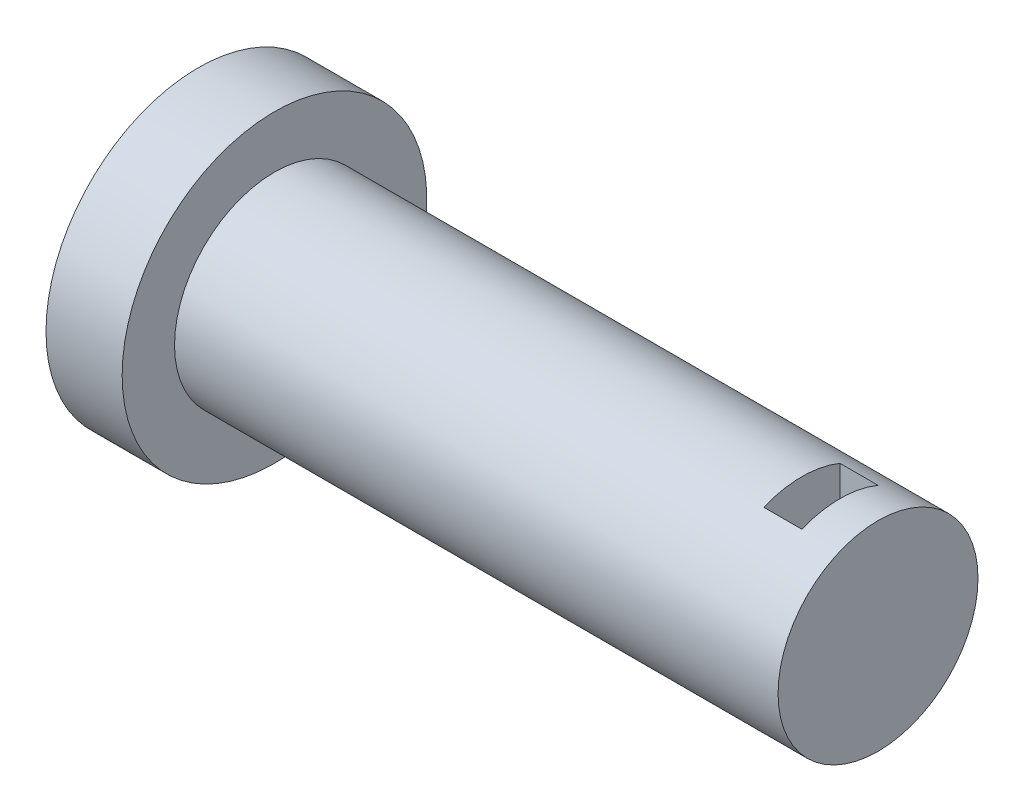
ISO-10303-21;
HEADER;
FILE_DESCRIPTION(('STEP AP214'),'2;1');
FILE_NAME('part.step','',(''),(''),'','','');
FILE_SCHEMA(('AUTOMOTIVE_DESIGN { 1 0 10303 214 1 1 1 1 }'));
ENDSEC;
DATA;
#1=APPLICATION_CONTEXT('core data for automotive mechanical design processes');
#2=APPLICATION_PROTOCOL_DEFINITION('international standard','automotive_design',2000,#1);
#3=PRODUCT_CONTEXT('',#1,'mechanical');
#4=PRODUCT('Part','Part','',(#3));
#5=PRODUCT_RELATED_PRODUCT_CATEGORY('part','',(#4));
#6=PRODUCT_DEFINITION_FORMATION('','',#4);
#7=PRODUCT_DEFINITION_CONTEXT('part definition',#1,'design');
#8=PRODUCT_DEFINITION('design','',#6,#7);
#9=PRODUCT_DEFINITION_SHAPE('','',#8);
#10=(LENGTH_UNIT() NAMED_UNIT(*) SI_UNIT(.MILLI.,.METRE.));
#11=(NAMED_UNIT(*) PLANE_ANGLE_UNIT() SI_UNIT($,.RADIAN.));
#12=(NAMED_UNIT(*) SI_UNIT($,.STERADIAN.) SOLID_ANGLE_UNIT());
#13=UNCERTAINTY_MEASURE_WITH_UNIT(LENGTH_MEASURE(1.E-05),#10,'distance_accuracy_value','');
#14=(GEOMETRIC_REPRESENTATION_CONTEXT(3) GLOBAL_UNCERTAINTY_ASSIGNED_CONTEXT((#13)) GLOBAL_UNIT_ASSIGNED_CONTEXT((#10,
#11,#12)) REPRESENTATION_CONTEXT('',''));
#15=CARTESIAN_POINT('',(0.,0.,0.));
#16=DIRECTION('',(0.,0.,1.));
#17=DIRECTION('',(1.,0.,0.));
#18=AXIS2_PLACEMENT_3D('',#15,#16,#17);
#19=CARTESIAN_POINT('',(158.5,0.,0.));
#20=DIRECTION('',(-1.,0.,0.));
#21=DIRECTION('',(0.,0.,1.));
#22=AXIS2_PLACEMENT_3D('',#19,#20,#21);
#23=CYLINDRICAL_SURFACE('',#22,26.25);
#24=DIRECTION('',(-1.,0.,0.));
#25=VECTOR('',#24,1.);
#26=CARTESIAN_POINT('',(158.5,24.2706097986845,10.));
#27=LINE('',#26,#25);
#28=CARTESIAN_POINT('',(148.5,24.2706097986845,10.));
#29=VERTEX_POINT('',#28);
#30=CARTESIAN_POINT('',(138.5,24.2706097986845,10.));
#31=VERTEX_POINT('',#30);
#32=EDGE_CURVE('E85',#29,#31,#27,.T.);
#33=ORIENTED_EDGE('',*,*,#32,.T.);
#34=CARTESIAN_POINT('',(138.5,0.,0.));
#35=DIRECTION('',(-1.,0.,0.));
#36=DIRECTION('',(0.,0.,1.));
#37=AXIS2_PLACEMENT_3D('',#34,#35,#36);
#38=CIRCLE('',#37,26.25);
#39=CARTESIAN_POINT('',(138.5,24.2706097986845,-10.));
#40=VERTEX_POINT('',#39);
#41=EDGE_CURVE('E11',#31,#40,#38,.T.);
#42=ORIENTED_EDGE('',*,*,#41,.T.);
#43=DIRECTION('',(-1.,0.,0.));
#44=VECTOR('',#43,1.);
#45=CARTESIAN_POINT('',(158.5,24.2706097986845,-10.));
#46=LINE('',#45,#44);
#47=CARTESIAN_POINT('',(148.5,24.2706097986845,-10.));
#48=VERTEX_POINT('',#47);
#49=EDGE_CURVE('E48',#40,#48,#46,.F.);
#50=ORIENTED_EDGE('',*,*,#49,.T.);
#51=CARTESIAN_POINT('',(148.5,0.,0.));
#52=DIRECTION('',(1.,0.,0.));
#53=DIRECTION('',(0.,0.,-1.));
#54=AXIS2_PLACEMENT_3D('',#51,#52,#53);
#55=CIRCLE('',#54,26.25);
#56=EDGE_CURVE('E90',#48,#29,#55,.T.);
#57=ORIENTED_EDGE('',*,*,#56,.T.);
#58=EDGE_LOOP('',(#33,#42,#50,#57));
#59=FACE_BOUND('',#58,.T.);
#60=DIRECTION('',(-1.,0.,0.));
#61=VECTOR('',#60,1.);
#62=CARTESIAN_POINT('',(158.5,-24.2706097986845,-10.));
#63=LINE('',#62,#61);
#64=CARTESIAN_POINT('',(148.5,-24.2706097986845,-10.));
#65=VERTEX_POINT('',#64);
#66=CARTESIAN_POINT('',(138.5,-24.2706097986845,-10.));
#67=VERTEX_POINT('',#66);
#68=EDGE_CURVE('E109',#65,#67,#63,.T.);
#69=ORIENTED_EDGE('',*,*,#68,.T.);
#70=CARTESIAN_POINT('',(138.5,-24.2706097986845,10.));
#71=VERTEX_POINT('',#70);
#72=EDGE_CURVE('E55',#67,#71,#38,.T.);
#73=ORIENTED_EDGE('',*,*,#72,.T.);
#74=DIRECTION('',(-1.,0.,0.));
#75=VECTOR('',#74,1.);
#76=CARTESIAN_POINT('',(158.5,-24.2706097986845,10.));
#77=LINE('',#76,#75);
#78=CARTESIAN_POINT('',(148.5,-24.2706097986845,10.));
#79=VERTEX_POINT('',#78);
#80=EDGE_CURVE('E110',#71,#79,#77,.F.);
#81=ORIENTED_EDGE('',*,*,#80,.T.);
#82=EDGE_CURVE('E96',#79,#65,#55,.T.);
#83=ORIENTED_EDGE('',*,*,#82,.T.);
#84=EDGE_LOOP('',(#69,#73,#81,#83));
#85=FACE_BOUND('',#84,.T.);
#86=CARTESIAN_POINT('',(158.5,0.,0.));
#87=DIRECTION('',(1.,0.,0.));
#88=DIRECTION('',(0.,0.,-1.));
#89=AXIS2_PLACEMENT_3D('',#86,#87,#88);
#90=CIRCLE('',#89,26.25);
#91=CARTESIAN_POINT('',(158.5,0.,-26.25));
#92=VERTEX_POINT('',#91);
#93=EDGE_CURVE('E114',#92,#92,#90,.T.);
#94=ORIENTED_EDGE('',*,*,#93,.F.);
#95=EDGE_LOOP('',(#94));
#96=FACE_BOUND('',#95,.T.);
#97=CARTESIAN_POINT('',(0.,0.,0.));
#98=DIRECTION('',(1.,0.,0.));
#99=DIRECTION('',(0.,0.,-1.));
#100=AXIS2_PLACEMENT_3D('',#97,#98,#99);
#101=CIRCLE('',#100,26.25);
#102=CARTESIAN_POINT('',(0.,0.,-26.25));
#103=VERTEX_POINT('',#102);
#104=EDGE_CURVE('E118',#103,#103,#101,.T.);
#105=ORIENTED_EDGE('',*,*,#104,.T.);
#106=EDGE_LOOP('',(#105));
#107=FACE_BOUND('',#106,.T.);
#108=ADVANCED_FACE('F45',(#59,#85,#96,#107),#23,.T.);
#109=CARTESIAN_POINT('',(158.5,0.,0.));
#110=DIRECTION('',(1.,0.,0.));
#111=DIRECTION('',(0.,0.,-1.));
#112=AXIS2_PLACEMENT_3D('',#109,#110,#111);
#113=PLANE('',#112);
#114=ORIENTED_EDGE('',*,*,#93,.T.);
#115=EDGE_LOOP('',(#114));
#116=FACE_BOUND('',#115,.T.);
#117=ADVANCED_FACE('F147',(#116),#113,.T.);
#118=CARTESIAN_POINT('',(-20.,0.,0.));
#119=DIRECTION('',(1.,0.,0.));
#120=DIRECTION('',(0.,0.,-1.));
#121=AXIS2_PLACEMENT_3D('',#118,#119,#120);
#122=CYLINDRICAL_SURFACE('',#121,40.);
#123=CARTESIAN_POINT('',(-20.,0.,0.));
#124=DIRECTION('',(-1.,0.,0.));
#125=DIRECTION('',(0.,0.,1.));
#126=AXIS2_PLACEMENT_3D('',#123,#124,#125);
#127=CIRCLE('',#126,40.);
#128=CARTESIAN_POINT('',(-20.,0.,40.));
#129=VERTEX_POINT('',#128);
#130=EDGE_CURVE('E123',#129,#129,#127,.T.);
#131=ORIENTED_EDGE('',*,*,#130,.F.);
#132=EDGE_LOOP('',(#131));
#133=FACE_BOUND('',#132,.T.);
#134=CARTESIAN_POINT('',(0.,0.,0.));
#135=DIRECTION('',(-1.,0.,0.));
#136=DIRECTION('',(0.,0.,1.));
#137=AXIS2_PLACEMENT_3D('',#134,#135,#136);
#138=CIRCLE('',#137,40.);
#139=CARTESIAN_POINT('',(0.,0.,40.));
#140=VERTEX_POINT('',#139);
#141=EDGE_CURVE('E125',#140,#140,#138,.T.);
#142=ORIENTED_EDGE('',*,*,#141,.T.);
#143=EDGE_LOOP('',(#142));
#144=FACE_BOUND('',#143,.T.);
#145=ADVANCED_FACE('F159',(#133,#144),#122,.T.);
#146=CARTESIAN_POINT('',(-20.,0.,0.));
#147=DIRECTION('',(-1.,0.,0.));
#148=DIRECTION('',(0.,0.,1.));
#149=AXIS2_PLACEMENT_3D('',#146,#147,#148);
#150=PLANE('',#149);
#151=ORIENTED_EDGE('',*,*,#130,.T.);
#152=EDGE_LOOP('',(#151));
#153=FACE_BOUND('',#152,.T.);
#154=ADVANCED_FACE('F155',(#153),#150,.T.);
#155=CARTESIAN_POINT('',(0.,0.,0.));
#156=DIRECTION('',(-1.,0.,0.));
#157=DIRECTION('',(0.,0.,1.));
#158=AXIS2_PLACEMENT_3D('',#155,#156,#157);
#159=PLANE('',#158);
#160=ORIENTED_EDGE('',*,*,#104,.F.);
#161=EDGE_LOOP('',(#160));
#162=FACE_BOUND('',#161,.T.);
#163=ORIENTED_EDGE('',*,*,#141,.F.);
#164=EDGE_LOOP('',(#163));
#165=FACE_BOUND('',#164,.T.);
#166=ADVANCED_FACE('F152',(#162,#165),#159,.F.);
#167=CARTESIAN_POINT('',(138.5,-40.,-10.));
#168=DIRECTION('',(-1.,0.,0.));
#169=DIRECTION('',(0.,0.,1.));
#170=AXIS2_PLACEMENT_3D('',#167,#168,#169);
#171=PLANE('',#170);
#172=DIRECTION('',(0.,1.,0.));
#173=VECTOR('',#172,1.);
#174=CARTESIAN_POINT('',(138.5,-40.,10.));
#175=LINE('',#174,#173);
#176=EDGE_CURVE('E62',#71,#31,#175,.T.);
#177=ORIENTED_EDGE('',*,*,#176,.F.);
#178=ORIENTED_EDGE('',*,*,#72,.F.);
#179=DIRECTION('',(0.,1.,0.));
#180=VECTOR('',#179,1.);
#181=CARTESIAN_POINT('',(138.5,-40.,-10.));
#182=LINE('',#181,#180);
#183=EDGE_CURVE('E129',#67,#40,#182,.T.);
#184=ORIENTED_EDGE('',*,*,#183,.T.);
#185=ORIENTED_EDGE('',*,*,#41,.F.);
#186=EDGE_LOOP('',(#177,#178,#184,#185));
#187=FACE_BOUND('',#186,.T.);
#188=ADVANCED_FACE('F141',(#187),#171,.F.);
#189=CARTESIAN_POINT('',(138.5,-40.,-10.));
#190=DIRECTION('',(0.,0.,-1.));
#191=DIRECTION('',(-1.,0.,0.));
#192=AXIS2_PLACEMENT_3D('',#189,#190,#191);
#193=PLANE('',#192);
#194=DIRECTION('',(0.,1.,0.));
#195=VECTOR('',#194,1.);
#196=CARTESIAN_POINT('',(148.5,-40.,-10.));
#197=LINE('',#196,#195);
#198=EDGE_CURVE('E99',#65,#48,#197,.T.);
#199=ORIENTED_EDGE('',*,*,#198,.T.);
#200=ORIENTED_EDGE('',*,*,#49,.F.);
#201=ORIENTED_EDGE('',*,*,#183,.F.);
#202=ORIENTED_EDGE('',*,*,#68,.F.);
#203=EDGE_LOOP('',(#199,#200,#201,#202));
#204=FACE_BOUND('',#203,.T.);
#205=ADVANCED_FACE('F143',(#204),#193,.F.);
#206=CARTESIAN_POINT('',(148.5,-40.,-10.));
#207=DIRECTION('',(1.,0.,0.));
#208=DIRECTION('',(0.,0.,-1.));
#209=AXIS2_PLACEMENT_3D('',#206,#207,#208);
#210=PLANE('',#209);
#211=ORIENTED_EDGE('',*,*,#198,.F.);
#212=ORIENTED_EDGE('',*,*,#82,.F.);
#213=DIRECTION('',(0.,1.,0.));
#214=VECTOR('',#213,1.);
#215=CARTESIAN_POINT('',(148.5,-40.,10.));
#216=LINE('',#215,#214);
#217=EDGE_CURVE('E67',#79,#29,#216,.T.);
#218=ORIENTED_EDGE('',*,*,#217,.T.);
#219=ORIENTED_EDGE('',*,*,#56,.F.);
#220=EDGE_LOOP('',(#211,#212,#218,#219));
#221=FACE_BOUND('',#220,.T.);
#222=ADVANCED_FACE('F93',(#221),#210,.F.);
#223=CARTESIAN_POINT('',(138.5,-40.,10.));
#224=DIRECTION('',(0.,0.,1.));
#225=DIRECTION('',(1.,0.,0.));
#226=AXIS2_PLACEMENT_3D('',#223,#224,#225);
#227=PLANE('',#226);
#228=ORIENTED_EDGE('',*,*,#217,.F.);
#229=ORIENTED_EDGE('',*,*,#80,.F.);
#230=ORIENTED_EDGE('',*,*,#176,.T.);
#231=ORIENTED_EDGE('',*,*,#32,.F.);
#232=EDGE_LOOP('',(#228,#229,#230,#231));
#233=FACE_BOUND('',#232,.T.);
#234=ADVANCED_FACE('F86',(#233),#227,.F.);
#235=CLOSED_SHELL('',(#108,#117,#145,#154,#166,#188,#205,#222,#234));
#236=MANIFOLD_SOLID_BREP('B2',#235);
#237=ADVANCED_BREP_SHAPE_REPRESENTATION('',(#18,#236),#14);
#238=SHAPE_DEFINITION_REPRESENTATION(#9,#237);
ENDSEC;
END-ISO-10303-21;
